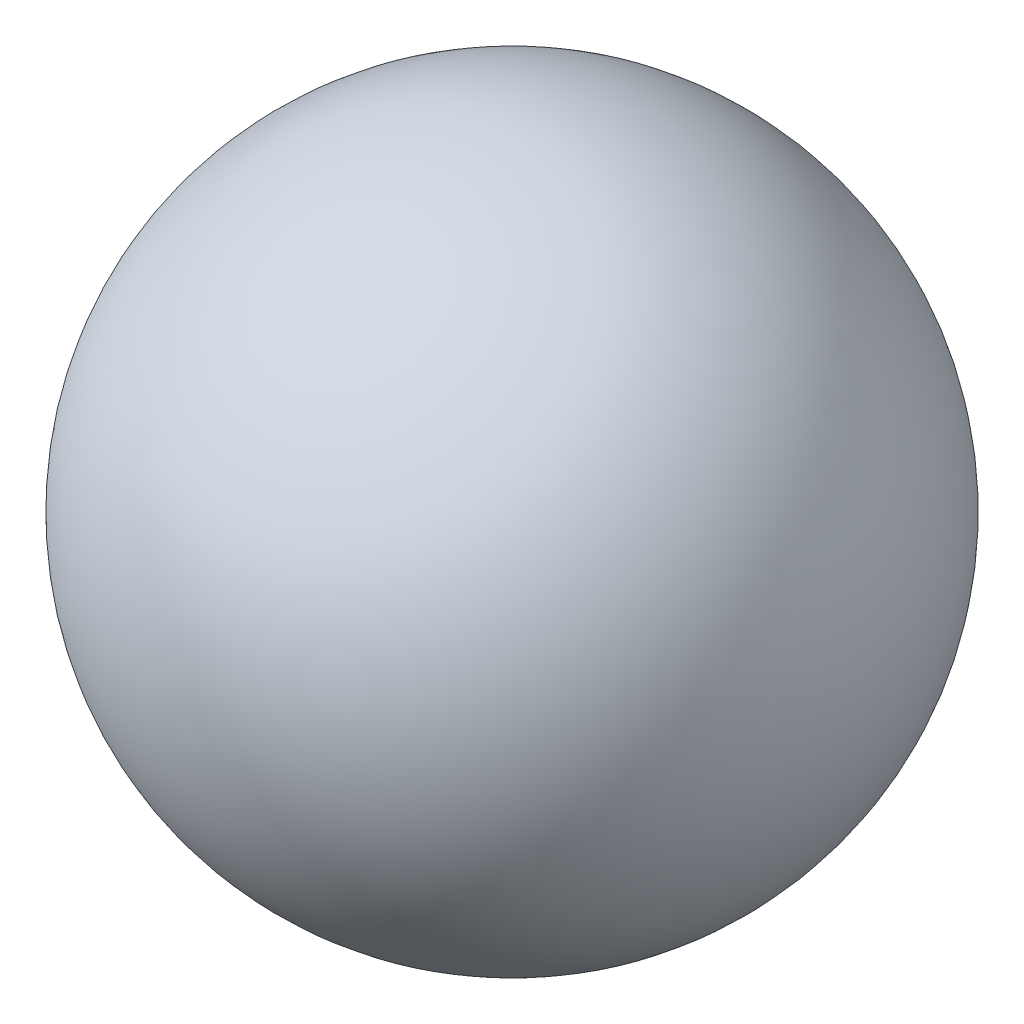
ISO-10303-21;
HEADER;
FILE_DESCRIPTION(('STEP AP214'),'2;1');
FILE_NAME('part.step','',(''),(''),'','','');
FILE_SCHEMA(('AUTOMOTIVE_DESIGN { 1 0 10303 214 1 1 1 1 }'));
ENDSEC;
DATA;
#1=APPLICATION_CONTEXT('core data for automotive mechanical design processes');
#2=APPLICATION_PROTOCOL_DEFINITION('international standard','automotive_design',2000,#1);
#3=PRODUCT_CONTEXT('',#1,'mechanical');
#4=PRODUCT('Part','Part','',(#3));
#5=PRODUCT_RELATED_PRODUCT_CATEGORY('part','',(#4));
#6=PRODUCT_DEFINITION_FORMATION('','',#4);
#7=PRODUCT_DEFINITION_CONTEXT('part definition',#1,'design');
#8=PRODUCT_DEFINITION('design','',#6,#7);
#9=PRODUCT_DEFINITION_SHAPE('','',#8);
#10=(LENGTH_UNIT() NAMED_UNIT(*) SI_UNIT(.MILLI.,.METRE.));
#11=(NAMED_UNIT(*) PLANE_ANGLE_UNIT() SI_UNIT($,.RADIAN.));
#12=(NAMED_UNIT(*) SI_UNIT($,.STERADIAN.) SOLID_ANGLE_UNIT());
#13=UNCERTAINTY_MEASURE_WITH_UNIT(LENGTH_MEASURE(1.E-05),#10,'distance_accuracy_value','');
#14=(GEOMETRIC_REPRESENTATION_CONTEXT(3) GLOBAL_UNCERTAINTY_ASSIGNED_CONTEXT((#13)) GLOBAL_UNIT_ASSIGNED_CONTEXT((#10,
#11,#12)) REPRESENTATION_CONTEXT('',''));
#15=CARTESIAN_POINT('',(0.,0.,0.));
#16=DIRECTION('',(0.,0.,1.));
#17=DIRECTION('',(1.,0.,0.));
#18=AXIS2_PLACEMENT_3D('',#15,#16,#17);
#19=CARTESIAN_POINT('',(0.,0.,0.));
#20=DIRECTION('',(0.,1.,0.));
#21=DIRECTION('',(1.,0.,0.));
#22=AXIS2_PLACEMENT_3D('',#19,#20,#21);
#23=SPHERICAL_SURFACE('',#22,30.1625);
#24=CARTESIAN_POINT('',(0.,30.1625,0.));
#25=VERTEX_POINT('',#24);
#26=VERTEX_LOOP('',#25);
#27=FACE_BOUND('',#26,.T.);
#28=ADVANCED_FACE('F30',(#27),#23,.T.);
#29=CLOSED_SHELL('',(#28));
#30=MANIFOLD_SOLID_BREP('B2',#29);
#31=ADVANCED_BREP_SHAPE_REPRESENTATION('',(#18,#30),#14);
#32=SHAPE_DEFINITION_REPRESENTATION(#9,#31);
ENDSEC;
END-ISO-10303-21;
